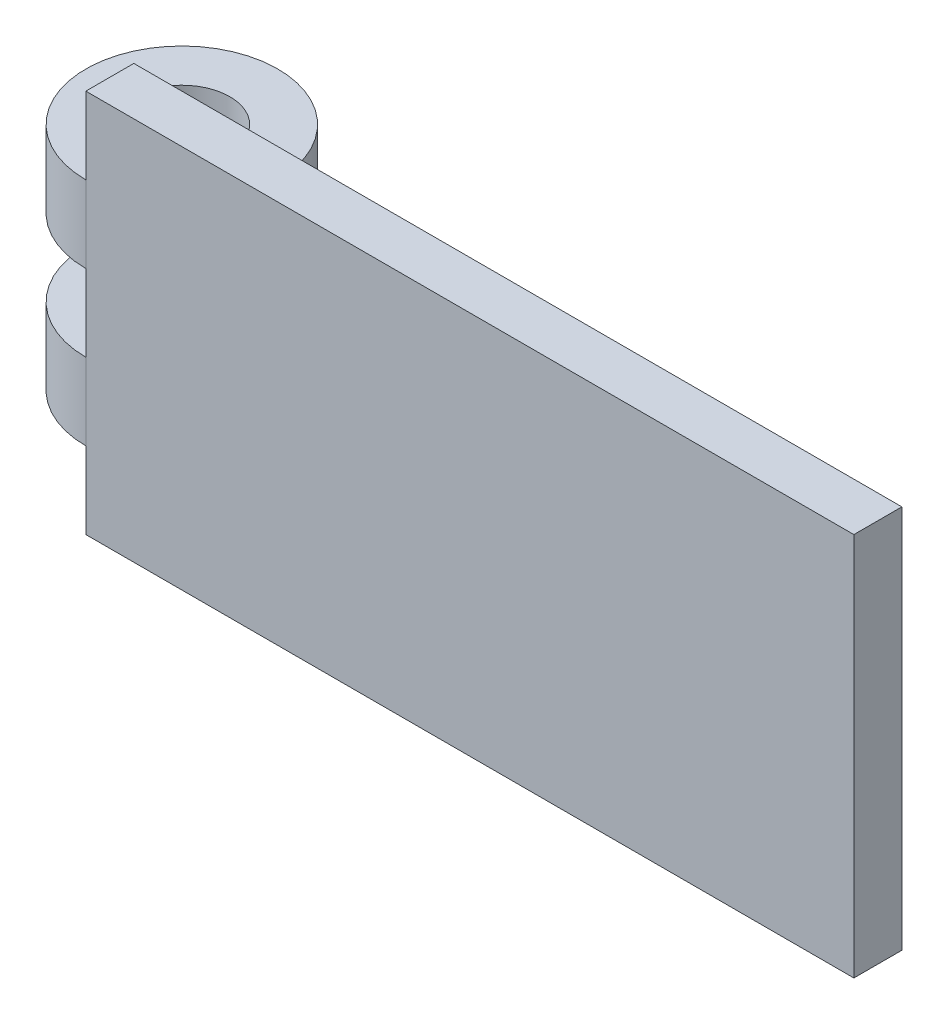
ISO-10303-21;
HEADER;
FILE_DESCRIPTION(('STEP AP214'),'2;1');
FILE_NAME('part.step','',(''),(''),'','','');
FILE_SCHEMA(('AUTOMOTIVE_DESIGN { 1 0 10303 214 1 1 1 1 }'));
ENDSEC;
DATA;
#1=APPLICATION_CONTEXT('core data for automotive mechanical design processes');
#2=APPLICATION_PROTOCOL_DEFINITION('international standard','automotive_design',2000,#1);
#3=PRODUCT_CONTEXT('',#1,'mechanical');
#4=PRODUCT('Part','Part','',(#3));
#5=PRODUCT_RELATED_PRODUCT_CATEGORY('part','',(#4));
#6=PRODUCT_DEFINITION_FORMATION('','',#4);
#7=PRODUCT_DEFINITION_CONTEXT('part definition',#1,'design');
#8=PRODUCT_DEFINITION('design','',#6,#7);
#9=PRODUCT_DEFINITION_SHAPE('','',#8);
#10=(LENGTH_UNIT() NAMED_UNIT(*) SI_UNIT(.MILLI.,.METRE.));
#11=(NAMED_UNIT(*) PLANE_ANGLE_UNIT() SI_UNIT($,.RADIAN.));
#12=(NAMED_UNIT(*) SI_UNIT($,.STERADIAN.) SOLID_ANGLE_UNIT());
#13=UNCERTAINTY_MEASURE_WITH_UNIT(LENGTH_MEASURE(1.E-05),#10,'distance_accuracy_value','');
#14=(GEOMETRIC_REPRESENTATION_CONTEXT(3) GLOBAL_UNCERTAINTY_ASSIGNED_CONTEXT((#13)) GLOBAL_UNIT_ASSIGNED_CONTEXT((#10,
#11,#12)) REPRESENTATION_CONTEXT('',''));
#15=CARTESIAN_POINT('',(0.,0.,0.));
#16=DIRECTION('',(0.,0.,1.));
#17=DIRECTION('',(1.,0.,0.));
#18=AXIS2_PLACEMENT_3D('',#15,#16,#17);
#19=CARTESIAN_POINT('',(0.,25.4,0.));
#20=DIRECTION('',(1.,0.,0.));
#21=DIRECTION('',(0.,0.,-1.));
#22=AXIS2_PLACEMENT_3D('',#19,#20,#21);
#23=PLANE('',#22);
#24=DIRECTION('',(0.,0.,1.));
#25=VECTOR('',#24,1.);
#26=CARTESIAN_POINT('',(0.,5.08,0.));
#27=LINE('',#26,#25);
#28=CARTESIAN_POINT('',(0.,5.08,-3.175));
#29=VERTEX_POINT('',#28);
#30=CARTESIAN_POINT('',(0.,5.08,0.));
#31=VERTEX_POINT('',#30);
#32=EDGE_CURVE('E136',#29,#31,#27,.T.);
#33=ORIENTED_EDGE('',*,*,#32,.F.);
#34=DIRECTION('',(0.,-1.,0.));
#35=VECTOR('',#34,1.);
#36=CARTESIAN_POINT('',(0.,25.4,-3.175));
#37=LINE('',#36,#35);
#38=CARTESIAN_POINT('',(0.,0.,-3.175));
#39=VERTEX_POINT('',#38);
#40=EDGE_CURVE('E169',#29,#39,#37,.T.);
#41=ORIENTED_EDGE('',*,*,#40,.T.);
#42=DIRECTION('',(0.,0.,1.));
#43=VECTOR('',#42,1.);
#44=CARTESIAN_POINT('',(0.,0.,0.));
#45=LINE('',#44,#43);
#46=CARTESIAN_POINT('',(0.,0.,0.));
#47=VERTEX_POINT('',#46);
#48=EDGE_CURVE('E158',#39,#47,#45,.T.);
#49=ORIENTED_EDGE('',*,*,#48,.T.);
#50=DIRECTION('',(0.,-1.,0.));
#51=VECTOR('',#50,1.);
#52=CARTESIAN_POINT('',(0.,25.4,0.));
#53=LINE('',#52,#51);
#54=EDGE_CURVE('E188',#31,#47,#53,.T.);
#55=ORIENTED_EDGE('',*,*,#54,.F.);
#56=EDGE_LOOP('',(#33,#41,#49,#55));
#57=FACE_BOUND('',#56,.T.);
#58=ADVANCED_FACE('F33',(#57),#23,.F.);
#59=CARTESIAN_POINT('',(0.,25.4,-3.175));
#60=DIRECTION('',(0.,0.,1.));
#61=DIRECTION('',(1.,0.,0.));
#62=AXIS2_PLACEMENT_3D('',#59,#60,#61);
#63=PLANE('',#62);
#64=DIRECTION('',(-1.,0.,0.));
#65=VECTOR('',#64,1.);
#66=CARTESIAN_POINT('',(0.,5.08,-3.175));
#67=LINE('',#66,#65);
#68=CARTESIAN_POINT('',(5.49926131403118,5.08,-3.175));
#69=VERTEX_POINT('',#68);
#70=EDGE_CURVE('E121',#69,#29,#67,.T.);
#71=ORIENTED_EDGE('',*,*,#70,.F.);
#72=DIRECTION('',(0.,1.,0.));
#73=VECTOR('',#72,1.);
#74=CARTESIAN_POINT('',(5.49926131403118,5.08,-3.175));
#75=LINE('',#74,#73);
#76=CARTESIAN_POINT('',(5.49926131403118,10.16,-3.175));
#77=VERTEX_POINT('',#76);
#78=EDGE_CURVE('E138',#69,#77,#75,.T.);
#79=ORIENTED_EDGE('',*,*,#78,.T.);
#80=DIRECTION('',(-1.,0.,0.));
#81=VECTOR('',#80,1.);
#82=CARTESIAN_POINT('',(0.,10.16,-3.175));
#83=LINE('',#82,#81);
#84=CARTESIAN_POINT('',(0.,10.16,-3.175));
#85=VERTEX_POINT('',#84);
#86=EDGE_CURVE('E122',#77,#85,#83,.T.);
#87=ORIENTED_EDGE('',*,*,#86,.T.);
#88=CARTESIAN_POINT('',(0.,15.24,-3.175));
#89=VERTEX_POINT('',#88);
#90=EDGE_CURVE('E182',#89,#85,#37,.T.);
#91=ORIENTED_EDGE('',*,*,#90,.F.);
#92=DIRECTION('',(-1.,0.,0.));
#93=VECTOR('',#92,1.);
#94=CARTESIAN_POINT('',(0.,15.24,-3.175));
#95=LINE('',#94,#93);
#96=CARTESIAN_POINT('',(5.49926131403118,15.24,-3.175));
#97=VERTEX_POINT('',#96);
#98=EDGE_CURVE('E11',#97,#89,#95,.T.);
#99=ORIENTED_EDGE('',*,*,#98,.F.);
#100=DIRECTION('',(0.,1.,0.));
#101=VECTOR('',#100,1.);
#102=CARTESIAN_POINT('',(5.49926131403118,15.24,-3.175));
#103=LINE('',#102,#101);
#104=CARTESIAN_POINT('',(5.49926131403118,20.32,-3.175));
#105=VERTEX_POINT('',#104);
#106=EDGE_CURVE('E41',#97,#105,#103,.T.);
#107=ORIENTED_EDGE('',*,*,#106,.T.);
#108=DIRECTION('',(-1.,0.,0.));
#109=VECTOR('',#108,1.);
#110=CARTESIAN_POINT('',(0.,20.32,-3.175));
#111=LINE('',#110,#109);
#112=CARTESIAN_POINT('',(0.,20.32,-3.175));
#113=VERTEX_POINT('',#112);
#114=EDGE_CURVE('E192',#105,#113,#111,.T.);
#115=ORIENTED_EDGE('',*,*,#114,.T.);
#116=CARTESIAN_POINT('',(0.,25.4,-3.175));
#117=VERTEX_POINT('',#116);
#118=EDGE_CURVE('E178',#117,#113,#37,.T.);
#119=ORIENTED_EDGE('',*,*,#118,.F.);
#120=DIRECTION('',(-1.,0.,0.));
#121=VECTOR('',#120,1.);
#122=CARTESIAN_POINT('',(0.,25.4,-3.175));
#123=LINE('',#122,#121);
#124=CARTESIAN_POINT('',(50.8,25.4,-3.175));
#125=VERTEX_POINT('',#124);
#126=EDGE_CURVE('E167',#125,#117,#123,.T.);
#127=ORIENTED_EDGE('',*,*,#126,.F.);
#128=DIRECTION('',(0.,-1.,0.));
#129=VECTOR('',#128,1.);
#130=CARTESIAN_POINT('',(50.8,25.4,-3.175));
#131=LINE('',#130,#129);
#132=CARTESIAN_POINT('',(50.8,0.,-3.175));
#133=VERTEX_POINT('',#132);
#134=EDGE_CURVE('E181',#125,#133,#131,.T.);
#135=ORIENTED_EDGE('',*,*,#134,.T.);
#136=DIRECTION('',(-1.,0.,0.));
#137=VECTOR('',#136,1.);
#138=CARTESIAN_POINT('',(0.,0.,-3.175));
#139=LINE('',#138,#137);
#140=EDGE_CURVE('E163',#133,#39,#139,.T.);
#141=ORIENTED_EDGE('',*,*,#140,.T.);
#142=ORIENTED_EDGE('',*,*,#40,.F.);
#143=EDGE_LOOP('',(#71,#79,#87,#91,#99,#107,#115,#119,#127,#135,#141,#142));
#144=FACE_BOUND('',#143,.T.);
#145=ADVANCED_FACE('F199',(#144),#63,.F.);
#146=ORIENTED_EDGE('',*,*,#90,.T.);
#147=DIRECTION('',(0.,0.,1.));
#148=VECTOR('',#147,1.);
#149=CARTESIAN_POINT('',(0.,10.16,0.));
#150=LINE('',#149,#148);
#151=CARTESIAN_POINT('',(0.,10.16,0.));
#152=VERTEX_POINT('',#151);
#153=EDGE_CURVE('E110',#85,#152,#150,.T.);
#154=ORIENTED_EDGE('',*,*,#153,.T.);
#155=CARTESIAN_POINT('',(0.,15.24,0.));
#156=VERTEX_POINT('',#155);
#157=EDGE_CURVE('E193',#156,#152,#53,.T.);
#158=ORIENTED_EDGE('',*,*,#157,.F.);
#159=DIRECTION('',(0.,0.,1.));
#160=VECTOR('',#159,1.);
#161=CARTESIAN_POINT('',(0.,15.24,0.));
#162=LINE('',#161,#160);
#163=EDGE_CURVE('E154',#89,#156,#162,.T.);
#164=ORIENTED_EDGE('',*,*,#163,.F.);
#165=EDGE_LOOP('',(#146,#154,#158,#164));
#166=FACE_BOUND('',#165,.T.);
#167=ADVANCED_FACE('F210',(#166),#23,.F.);
#168=ORIENTED_EDGE('',*,*,#118,.T.);
#169=DIRECTION('',(0.,0.,1.));
#170=VECTOR('',#169,1.);
#171=CARTESIAN_POINT('',(0.,20.32,0.));
#172=LINE('',#171,#170);
#173=CARTESIAN_POINT('',(0.,20.32,0.));
#174=VERTEX_POINT('',#173);
#175=EDGE_CURVE('E149',#113,#174,#172,.T.);
#176=ORIENTED_EDGE('',*,*,#175,.T.);
#177=CARTESIAN_POINT('',(0.,25.4,0.));
#178=VERTEX_POINT('',#177);
#179=EDGE_CURVE('E189',#178,#174,#53,.T.);
#180=ORIENTED_EDGE('',*,*,#179,.F.);
#181=DIRECTION('',(0.,0.,1.));
#182=VECTOR('',#181,1.);
#183=CARTESIAN_POINT('',(0.,25.4,0.));
#184=LINE('',#183,#182);
#185=EDGE_CURVE('E159',#117,#178,#184,.T.);
#186=ORIENTED_EDGE('',*,*,#185,.F.);
#187=EDGE_LOOP('',(#168,#176,#180,#186));
#188=FACE_BOUND('',#187,.T.);
#189=ADVANCED_FACE('F35',(#188),#23,.F.);
#190=CARTESIAN_POINT('',(0.,25.4,0.));
#191=DIRECTION('',(0.,0.,-1.));
#192=DIRECTION('',(-1.,0.,0.));
#193=AXIS2_PLACEMENT_3D('',#190,#191,#192);
#194=PLANE('',#193);
#195=DIRECTION('',(1.,0.,0.));
#196=VECTOR('',#195,1.);
#197=CARTESIAN_POINT('',(0.,0.,0.));
#198=LINE('',#197,#196);
#199=CARTESIAN_POINT('',(50.8,0.,0.));
#200=VERTEX_POINT('',#199);
#201=EDGE_CURVE('E172',#47,#200,#198,.T.);
#202=ORIENTED_EDGE('',*,*,#201,.T.);
#203=DIRECTION('',(0.,-1.,0.));
#204=VECTOR('',#203,1.);
#205=CARTESIAN_POINT('',(50.8,25.4,0.));
#206=LINE('',#205,#204);
#207=CARTESIAN_POINT('',(50.8,25.4,0.));
#208=VERTEX_POINT('',#207);
#209=EDGE_CURVE('E185',#208,#200,#206,.T.);
#210=ORIENTED_EDGE('',*,*,#209,.F.);
#211=DIRECTION('',(1.,0.,0.));
#212=VECTOR('',#211,1.);
#213=CARTESIAN_POINT('',(0.,25.4,0.));
#214=LINE('',#213,#212);
#215=EDGE_CURVE('E162',#178,#208,#214,.T.);
#216=ORIENTED_EDGE('',*,*,#215,.F.);
#217=ORIENTED_EDGE('',*,*,#179,.T.);
#218=DIRECTION('',(0.,1.,0.));
#219=VECTOR('',#218,1.);
#220=CARTESIAN_POINT('',(0.,15.24,0.));
#221=LINE('',#220,#219);
#222=EDGE_CURVE('E156',#156,#174,#221,.T.);
#223=ORIENTED_EDGE('',*,*,#222,.F.);
#224=ORIENTED_EDGE('',*,*,#157,.T.);
#225=EDGE_CURVE('E358',#152,#31,#53,.T.);
#226=ORIENTED_EDGE('',*,*,#225,.T.);
#227=ORIENTED_EDGE('',*,*,#54,.T.);
#228=EDGE_LOOP('',(#202,#210,#216,#217,#223,#224,#226,#227));
#229=FACE_BOUND('',#228,.T.);
#230=ADVANCED_FACE('F226',(#229),#194,.F.);
#231=CARTESIAN_POINT('',(50.8,25.4,0.));
#232=DIRECTION('',(-1.,0.,0.));
#233=DIRECTION('',(0.,0.,1.));
#234=AXIS2_PLACEMENT_3D('',#231,#232,#233);
#235=PLANE('',#234);
#236=DIRECTION('',(0.,0.,-1.));
#237=VECTOR('',#236,1.);
#238=CARTESIAN_POINT('',(50.8,0.,0.));
#239=LINE('',#238,#237);
#240=EDGE_CURVE('E174',#200,#133,#239,.T.);
#241=ORIENTED_EDGE('',*,*,#240,.T.);
#242=ORIENTED_EDGE('',*,*,#134,.F.);
#243=DIRECTION('',(0.,0.,-1.));
#244=VECTOR('',#243,1.);
#245=CARTESIAN_POINT('',(50.8,25.4,0.));
#246=LINE('',#245,#244);
#247=EDGE_CURVE('E165',#208,#125,#246,.T.);
#248=ORIENTED_EDGE('',*,*,#247,.F.);
#249=ORIENTED_EDGE('',*,*,#209,.T.);
#250=EDGE_LOOP('',(#241,#242,#248,#249));
#251=FACE_BOUND('',#250,.T.);
#252=ADVANCED_FACE('F230',(#251),#235,.F.);
#253=CARTESIAN_POINT('',(0.,25.4,0.));
#254=DIRECTION('',(0.,-1.,0.));
#255=DIRECTION('',(0.,0.,-1.));
#256=AXIS2_PLACEMENT_3D('',#253,#254,#255);
#257=PLANE('',#256);
#258=ORIENTED_EDGE('',*,*,#185,.T.);
#259=ORIENTED_EDGE('',*,*,#215,.T.);
#260=ORIENTED_EDGE('',*,*,#247,.T.);
#261=ORIENTED_EDGE('',*,*,#126,.T.);
#262=EDGE_LOOP('',(#258,#259,#260,#261));
#263=FACE_BOUND('',#262,.T.);
#264=ADVANCED_FACE('F232',(#263),#257,.F.);
#265=CARTESIAN_POINT('',(0.,0.,0.));
#266=DIRECTION('',(0.,-1.,0.));
#267=DIRECTION('',(0.,0.,-1.));
#268=AXIS2_PLACEMENT_3D('',#265,#266,#267);
#269=PLANE('',#268);
#270=ORIENTED_EDGE('',*,*,#48,.F.);
#271=ORIENTED_EDGE('',*,*,#140,.F.);
#272=ORIENTED_EDGE('',*,*,#240,.F.);
#273=ORIENTED_EDGE('',*,*,#201,.F.);
#274=EDGE_LOOP('',(#270,#271,#272,#273));
#275=FACE_BOUND('',#274,.T.);
#276=ADVANCED_FACE('F223',(#275),#269,.T.);
#277=CARTESIAN_POINT('',(0.,15.24,-6.35));
#278=DIRECTION('',(0.,1.,0.));
#279=DIRECTION('',(0.,0.,1.));
#280=AXIS2_PLACEMENT_3D('',#277,#278,#279);
#281=PLANE('',#280);
#282=CARTESIAN_POINT('',(0.,15.24,-6.35));
#283=DIRECTION('',(0.,1.,0.));
#284=DIRECTION('',(0.,0.,1.));
#285=AXIS2_PLACEMENT_3D('',#282,#283,#284);
#286=CIRCLE('',#285,3.175);
#287=EDGE_CURVE('E141',#89,#89,#286,.T.);
#288=ORIENTED_EDGE('',*,*,#287,.T.);
#289=ORIENTED_EDGE('',*,*,#163,.T.);
#290=CARTESIAN_POINT('',(0.,15.24,-6.35));
#291=DIRECTION('',(0.,1.,0.));
#292=DIRECTION('',(0.,0.,1.));
#293=AXIS2_PLACEMENT_3D('',#290,#291,#292);
#294=CIRCLE('',#293,6.35);
#295=EDGE_CURVE('E146',#97,#156,#294,.T.);
#296=ORIENTED_EDGE('',*,*,#295,.F.);
#297=ORIENTED_EDGE('',*,*,#98,.T.);
#298=EDGE_LOOP('',(#288,#289,#296,#297));
#299=FACE_BOUND('',#298,.T.);
#300=ADVANCED_FACE('F207',(#299),#281,.F.);
#301=CARTESIAN_POINT('',(0.,20.32,-6.35));
#302=DIRECTION('',(0.,1.,0.));
#303=DIRECTION('',(0.,0.,1.));
#304=AXIS2_PLACEMENT_3D('',#301,#302,#303);
#305=PLANE('',#304);
#306=ORIENTED_EDGE('',*,*,#175,.F.);
#307=CARTESIAN_POINT('',(0.,20.32,-6.35));
#308=DIRECTION('',(0.,1.,0.));
#309=DIRECTION('',(0.,0.,1.));
#310=AXIS2_PLACEMENT_3D('',#307,#308,#309);
#311=CIRCLE('',#310,3.175);
#312=EDGE_CURVE('E56',#113,#113,#311,.T.);
#313=ORIENTED_EDGE('',*,*,#312,.F.);
#314=ORIENTED_EDGE('',*,*,#114,.F.);
#315=CARTESIAN_POINT('',(0.,20.32,-6.35));
#316=DIRECTION('',(0.,1.,0.));
#317=DIRECTION('',(0.,0.,1.));
#318=AXIS2_PLACEMENT_3D('',#315,#316,#317);
#319=CIRCLE('',#318,6.35);
#320=EDGE_CURVE('E144',#105,#174,#319,.T.);
#321=ORIENTED_EDGE('',*,*,#320,.T.);
#322=EDGE_LOOP('',(#306,#313,#314,#321));
#323=FACE_BOUND('',#322,.T.);
#324=ADVANCED_FACE('F236',(#323),#305,.T.);
#325=CARTESIAN_POINT('',(0.,15.24,-6.35));
#326=DIRECTION('',(0.,1.,0.));
#327=DIRECTION('',(0.,0.,1.));
#328=AXIS2_PLACEMENT_3D('',#325,#326,#327);
#329=CYLINDRICAL_SURFACE('',#328,6.35);
#330=ORIENTED_EDGE('',*,*,#295,.T.);
#331=ORIENTED_EDGE('',*,*,#222,.T.);
#332=ORIENTED_EDGE('',*,*,#320,.F.);
#333=ORIENTED_EDGE('',*,*,#106,.F.);
#334=EDGE_LOOP('',(#330,#331,#332,#333));
#335=FACE_BOUND('',#334,.T.);
#336=ADVANCED_FACE('F205',(#335),#329,.T.);
#337=CARTESIAN_POINT('',(0.,15.24,-6.35));
#338=DIRECTION('',(0.,1.,0.));
#339=DIRECTION('',(0.,0.,1.));
#340=AXIS2_PLACEMENT_3D('',#337,#338,#339);
#341=CYLINDRICAL_SURFACE('',#340,3.175);
#342=ORIENTED_EDGE('',*,*,#312,.T.);
#343=EDGE_LOOP('',(#342));
#344=FACE_BOUND('',#343,.T.);
#345=ORIENTED_EDGE('',*,*,#287,.F.);
#346=EDGE_LOOP('',(#345));
#347=FACE_BOUND('',#346,.T.);
#348=ADVANCED_FACE('F243',(#344,#347),#341,.F.);
#349=CARTESIAN_POINT('',(0.,5.08,-6.35));
#350=DIRECTION('',(0.,1.,0.));
#351=DIRECTION('',(0.,0.,1.));
#352=AXIS2_PLACEMENT_3D('',#349,#350,#351);
#353=CYLINDRICAL_SURFACE('',#352,6.35);
#354=ORIENTED_EDGE('',*,*,#78,.F.);
#355=CARTESIAN_POINT('',(0.,5.08,-6.35));
#356=DIRECTION('',(0.,1.,0.));
#357=DIRECTION('',(0.,0.,1.));
#358=AXIS2_PLACEMENT_3D('',#355,#356,#357);
#359=CIRCLE('',#358,6.35);
#360=EDGE_CURVE('E48',#69,#31,#359,.T.);
#361=ORIENTED_EDGE('',*,*,#360,.T.);
#362=ORIENTED_EDGE('',*,*,#225,.F.);
#363=CARTESIAN_POINT('',(0.,10.16,-6.35));
#364=DIRECTION('',(0.,1.,0.));
#365=DIRECTION('',(0.,0.,1.));
#366=AXIS2_PLACEMENT_3D('',#363,#364,#365);
#367=CIRCLE('',#366,6.35);
#368=EDGE_CURVE('E116',#77,#152,#367,.T.);
#369=ORIENTED_EDGE('',*,*,#368,.F.);
#370=EDGE_LOOP('',(#354,#361,#362,#369));
#371=FACE_BOUND('',#370,.T.);
#372=ADVANCED_FACE('F297',(#371),#353,.T.);
#373=CARTESIAN_POINT('',(0.,5.08,-6.35));
#374=DIRECTION('',(0.,1.,0.));
#375=DIRECTION('',(0.,0.,1.));
#376=AXIS2_PLACEMENT_3D('',#373,#374,#375);
#377=PLANE('',#376);
#378=CARTESIAN_POINT('',(0.,5.08,-6.35));
#379=DIRECTION('',(0.,1.,0.));
#380=DIRECTION('',(0.,0.,1.));
#381=AXIS2_PLACEMENT_3D('',#378,#379,#380);
#382=CIRCLE('',#381,3.175);
#383=EDGE_CURVE('E127',#29,#29,#382,.T.);
#384=ORIENTED_EDGE('',*,*,#383,.T.);
#385=ORIENTED_EDGE('',*,*,#32,.T.);
#386=ORIENTED_EDGE('',*,*,#360,.F.);
#387=ORIENTED_EDGE('',*,*,#70,.T.);
#388=EDGE_LOOP('',(#384,#385,#386,#387));
#389=FACE_BOUND('',#388,.T.);
#390=ADVANCED_FACE('F328',(#389),#377,.F.);
#391=CARTESIAN_POINT('',(0.,10.16,-6.35));
#392=DIRECTION('',(0.,1.,0.));
#393=DIRECTION('',(0.,0.,1.));
#394=AXIS2_PLACEMENT_3D('',#391,#392,#393);
#395=PLANE('',#394);
#396=ORIENTED_EDGE('',*,*,#153,.F.);
#397=CARTESIAN_POINT('',(0.,10.16,-6.35));
#398=DIRECTION('',(0.,1.,0.));
#399=DIRECTION('',(0.,0.,1.));
#400=AXIS2_PLACEMENT_3D('',#397,#398,#399);
#401=CIRCLE('',#400,3.175);
#402=EDGE_CURVE('E113',#85,#85,#401,.T.);
#403=ORIENTED_EDGE('',*,*,#402,.F.);
#404=ORIENTED_EDGE('',*,*,#86,.F.);
#405=ORIENTED_EDGE('',*,*,#368,.T.);
#406=EDGE_LOOP('',(#396,#403,#404,#405));
#407=FACE_BOUND('',#406,.T.);
#408=ADVANCED_FACE('F112',(#407),#395,.T.);
#409=CARTESIAN_POINT('',(0.,5.08,-6.35));
#410=DIRECTION('',(0.,1.,0.));
#411=DIRECTION('',(0.,0.,1.));
#412=AXIS2_PLACEMENT_3D('',#409,#410,#411);
#413=CYLINDRICAL_SURFACE('',#412,3.175);
#414=ORIENTED_EDGE('',*,*,#402,.T.);
#415=EDGE_LOOP('',(#414));
#416=FACE_BOUND('',#415,.T.);
#417=ORIENTED_EDGE('',*,*,#383,.F.);
#418=EDGE_LOOP('',(#417));
#419=FACE_BOUND('',#418,.T.);
#420=ADVANCED_FACE('F125',(#416,#419),#413,.F.);
#421=CLOSED_SHELL('',(#58,#145,#167,#189,#230,#252,#264,#276,#300,#324,#336,#348,#372,#390,#408,#420));
#422=MANIFOLD_SOLID_BREP('B2',#421);
#423=ADVANCED_BREP_SHAPE_REPRESENTATION('',(#18,#422),#14);
#424=SHAPE_DEFINITION_REPRESENTATION(#9,#423);
ENDSEC;
END-ISO-10303-21;
